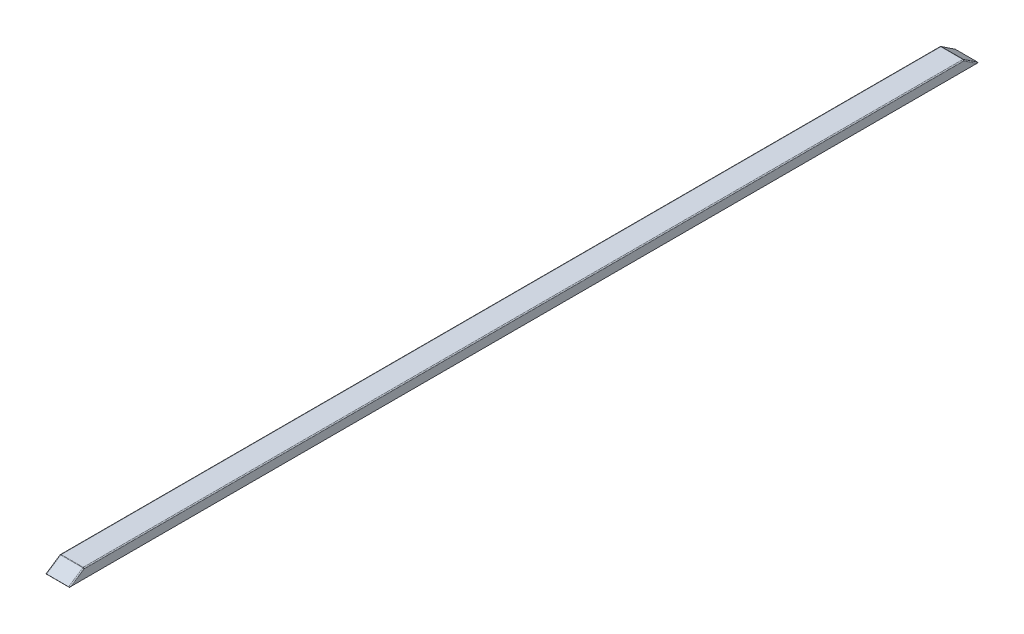
ISO-10303-21;
HEADER;
FILE_DESCRIPTION(('STEP AP214'),'2;1');
FILE_NAME('part.step','',(''),(''),'','','');
FILE_SCHEMA(('AUTOMOTIVE_DESIGN { 1 0 10303 214 1 1 1 1 }'));
ENDSEC;
DATA;
#1=APPLICATION_CONTEXT('core data for automotive mechanical design processes');
#2=APPLICATION_PROTOCOL_DEFINITION('international standard','automotive_design',2000,#1);
#3=PRODUCT_CONTEXT('',#1,'mechanical');
#4=PRODUCT('Part','Part','',(#3));
#5=PRODUCT_RELATED_PRODUCT_CATEGORY('part','',(#4));
#6=PRODUCT_DEFINITION_FORMATION('','',#4);
#7=PRODUCT_DEFINITION_CONTEXT('part definition',#1,'design');
#8=PRODUCT_DEFINITION('design','',#6,#7);
#9=PRODUCT_DEFINITION_SHAPE('','',#8);
#10=(LENGTH_UNIT() NAMED_UNIT(*) SI_UNIT(.MILLI.,.METRE.));
#11=(NAMED_UNIT(*) PLANE_ANGLE_UNIT() SI_UNIT($,.RADIAN.));
#12=(NAMED_UNIT(*) SI_UNIT($,.STERADIAN.) SOLID_ANGLE_UNIT());
#13=UNCERTAINTY_MEASURE_WITH_UNIT(LENGTH_MEASURE(1.E-05),#10,'distance_accuracy_value','');
#14=(GEOMETRIC_REPRESENTATION_CONTEXT(3) GLOBAL_UNCERTAINTY_ASSIGNED_CONTEXT((#13)) GLOBAL_UNIT_ASSIGNED_CONTEXT((#10,
#11,#12)) REPRESENTATION_CONTEXT('',''));
#15=CARTESIAN_POINT('',(0.,0.,0.));
#16=DIRECTION('',(0.,0.,1.));
#17=DIRECTION('',(1.,0.,0.));
#18=AXIS2_PLACEMENT_3D('',#15,#16,#17);
#19=CARTESIAN_POINT('',(0.,0.,1900.));
#20=DIRECTION('',(0.,1.,0.));
#21=DIRECTION('',(0.,0.,1.));
#22=AXIS2_PLACEMENT_3D('',#19,#20,#21);
#23=PLANE('',#22);
#24=DIRECTION('',(0.,0.,-1.));
#25=VECTOR('',#24,1.);
#26=CARTESIAN_POINT('',(0.,0.,1900.));
#27=LINE('',#26,#25);
#28=CARTESIAN_POINT('',(0.,0.,1896.39444872454));
#29=VERTEX_POINT('',#28);
#30=CARTESIAN_POINT('',(0.,0.,3.6055512754638));
#31=VERTEX_POINT('',#30);
#32=EDGE_CURVE('E320',#29,#31,#27,.T.);
#33=ORIENTED_EDGE('',*,*,#32,.T.);
#34=CARTESIAN_POINT('',(2.,-1.11022302462516E-13,3.60555127546358));
#35=DIRECTION('',(0.,1.,0.));
#36=DIRECTION('',(0.,0.,-1.));
#37=AXIS2_PLACEMENT_3D('',#34,#35,#36);
#38=ELLIPSE('',#37,3.60555127546399,2.);
#39=CARTESIAN_POINT('',(0.267949192431039,0.,1.8027756377319));
#40=VERTEX_POINT('',#39);
#41=EDGE_CURVE('E263',#31,#40,#38,.F.);
#42=ORIENTED_EDGE('',*,*,#41,.T.);
#43=DIRECTION('',(-1.,0.,0.));
#44=VECTOR('',#43,1.);
#45=CARTESIAN_POINT('',(0.,0.,1.8027756377319));
#46=LINE('',#45,#44);
#47=CARTESIAN_POINT('',(2.,-1.11022302462516E-13,1.80277563773146));
#48=VERTEX_POINT('',#47);
#49=EDGE_CURVE('E349',#48,#40,#46,.T.);
#50=ORIENTED_EDGE('',*,*,#49,.F.);
#51=DIRECTION('',(0.,0.,-1.));
#52=VECTOR('',#51,1.);
#53=CARTESIAN_POINT('',(2.,0.,1900.));
#54=LINE('',#53,#52);
#55=CARTESIAN_POINT('',(2.,0.,1898.19722436226));
#56=VERTEX_POINT('',#55);
#57=EDGE_CURVE('E332',#56,#48,#54,.T.);
#58=ORIENTED_EDGE('',*,*,#57,.F.);
#59=DIRECTION('',(1.,0.,0.));
#60=VECTOR('',#59,1.);
#61=CARTESIAN_POINT('',(0.,0.,1898.19722436226));
#62=LINE('',#61,#60);
#63=CARTESIAN_POINT('',(0.267949192428123,0.,1898.19722436226));
#64=VERTEX_POINT('',#63);
#65=EDGE_CURVE('E182',#64,#56,#62,.T.);
#66=ORIENTED_EDGE('',*,*,#65,.F.);
#67=CARTESIAN_POINT('',(2.,0.,1896.39444872454));
#68=DIRECTION('',(0.,1.,0.));
#69=DIRECTION('',(0.,0.,-1.));
#70=AXIS2_PLACEMENT_3D('',#67,#68,#69);
#71=ELLIPSE('',#70,3.60555127546401,2.);
#72=EDGE_CURVE('E235',#64,#29,#71,.F.);
#73=ORIENTED_EDGE('',*,*,#72,.T.);
#74=EDGE_LOOP('',(#33,#42,#50,#58,#66,#73));
#75=FACE_BOUND('',#74,.T.);
#76=ADVANCED_FACE('F35',(#75),#23,.F.);
#77=CARTESIAN_POINT('',(2.,0.,1900.));
#78=DIRECTION('',(-1.,0.,0.));
#79=DIRECTION('',(0.,0.,1.));
#80=AXIS2_PLACEMENT_3D('',#77,#78,#79);
#81=PLANE('',#80);
#82=DIRECTION('',(0.,0.554700196225229,-0.832050294337844));
#83=VECTOR('',#82,1.);
#84=CARTESIAN_POINT('',(2.,-0.832050294342159,1899.44529980377));
#85=LINE('',#84,#83);
#86=CARTESIAN_POINT('',(2.,16.,1874.19722436226));
#87=VERTEX_POINT('',#86);
#88=EDGE_CURVE('E175',#56,#87,#85,.T.);
#89=ORIENTED_EDGE('',*,*,#88,.F.);
#90=ORIENTED_EDGE('',*,*,#57,.T.);
#91=DIRECTION('',(0.,-0.554700196225229,-0.832050294337844));
#92=VECTOR('',#91,1.);
#93=CARTESIAN_POINT('',(2.,876.091026628739,1315.93931558084));
#94=LINE('',#93,#92);
#95=CARTESIAN_POINT('',(2.,16.,25.8027756377321));
#96=VERTEX_POINT('',#95);
#97=EDGE_CURVE('E200',#96,#48,#94,.T.);
#98=ORIENTED_EDGE('',*,*,#97,.F.);
#99=DIRECTION('',(0.,0.,-1.));
#100=VECTOR('',#99,1.);
#101=CARTESIAN_POINT('',(2.,16.,1900.));
#102=LINE('',#101,#100);
#103=EDGE_CURVE('E193',#96,#87,#102,.F.);
#104=ORIENTED_EDGE('',*,*,#103,.T.);
#105=EDGE_LOOP('',(#89,#90,#98,#104));
#106=FACE_BOUND('',#105,.T.);
#107=ADVANCED_FACE('F198',(#106),#81,.F.);
#108=CARTESIAN_POINT('',(2.,18.,1900.));
#109=DIRECTION('',(0.,1.,0.));
#110=DIRECTION('',(0.,0.,1.));
#111=AXIS2_PLACEMENT_3D('',#108,#109,#110);
#112=PLANE('',#111);
#113=DIRECTION('',(1.,0.,0.));
#114=VECTOR('',#113,1.);
#115=CARTESIAN_POINT('',(2.,18.,1871.19722436226));
#116=LINE('',#115,#114);
#117=CARTESIAN_POINT('',(4.,18.,1871.19722436226));
#118=VERTEX_POINT('',#117);
#119=CARTESIAN_POINT('',(46.,18.,1871.19722436226));
#120=VERTEX_POINT('',#119);
#121=EDGE_CURVE('E186',#118,#120,#116,.T.);
#122=ORIENTED_EDGE('',*,*,#121,.F.);
#123=DIRECTION('',(0.,0.,-1.));
#124=VECTOR('',#123,1.);
#125=CARTESIAN_POINT('',(4.,18.,0.));
#126=LINE('',#125,#124);
#127=CARTESIAN_POINT('',(4.,18.,28.8027756377321));
#128=VERTEX_POINT('',#127);
#129=EDGE_CURVE('E195',#118,#128,#126,.T.);
#130=ORIENTED_EDGE('',*,*,#129,.T.);
#131=DIRECTION('',(-1.,0.,0.));
#132=VECTOR('',#131,1.);
#133=CARTESIAN_POINT('',(2.,18.,28.802775637732));
#134=LINE('',#133,#132);
#135=CARTESIAN_POINT('',(46.,18.,28.802775637732));
#136=VERTEX_POINT('',#135);
#137=EDGE_CURVE('E338',#136,#128,#134,.T.);
#138=ORIENTED_EDGE('',*,*,#137,.F.);
#139=DIRECTION('',(0.,0.,-1.));
#140=VECTOR('',#139,1.);
#141=CARTESIAN_POINT('',(46.,18.,1900.));
#142=LINE('',#141,#140);
#143=EDGE_CURVE('E202',#136,#120,#142,.F.);
#144=ORIENTED_EDGE('',*,*,#143,.T.);
#145=EDGE_LOOP('',(#122,#130,#138,#144));
#146=FACE_BOUND('',#145,.T.);
#147=ADVANCED_FACE('F336',(#146),#112,.F.);
#148=CARTESIAN_POINT('',(48.,18.,1900.));
#149=DIRECTION('',(1.,0.,0.));
#150=DIRECTION('',(0.,0.,-1.));
#151=AXIS2_PLACEMENT_3D('',#148,#149,#150);
#152=PLANE('',#151);
#153=DIRECTION('',(0.,-0.554700196225229,0.832050294337844));
#154=VECTOR('',#153,1.);
#155=CARTESIAN_POINT('',(48.,4.70641124411937,1891.13760749608));
#156=LINE('',#155,#154);
#157=CARTESIAN_POINT('',(48.,16.,1874.19722436226));
#158=VERTEX_POINT('',#157);
#159=CARTESIAN_POINT('',(48.,0.,1898.19722436226));
#160=VERTEX_POINT('',#159);
#161=EDGE_CURVE('E363',#158,#160,#156,.T.);
#162=ORIENTED_EDGE('',*,*,#161,.F.);
#163=DIRECTION('',(0.,0.,-1.));
#164=VECTOR('',#163,1.);
#165=CARTESIAN_POINT('',(48.,16.,0.));
#166=LINE('',#165,#164);
#167=CARTESIAN_POINT('',(48.,16.,25.8027756377321));
#168=VERTEX_POINT('',#167);
#169=EDGE_CURVE('E334',#158,#168,#166,.T.);
#170=ORIENTED_EDGE('',*,*,#169,.T.);
#171=DIRECTION('',(0.,0.554700196225229,0.832050294337844));
#172=VECTOR('',#171,1.);
#173=CARTESIAN_POINT('',(48.,881.629488167201,1324.24700788853));
#174=LINE('',#173,#172);
#175=CARTESIAN_POINT('',(48.,0.,1.80277563773235));
#176=VERTEX_POINT('',#175);
#177=EDGE_CURVE('E322',#176,#168,#174,.T.);
#178=ORIENTED_EDGE('',*,*,#177,.F.);
#179=DIRECTION('',(0.,0.,-1.));
#180=VECTOR('',#179,1.);
#181=CARTESIAN_POINT('',(48.,0.,1900.));
#182=LINE('',#181,#180);
#183=EDGE_CURVE('E329',#160,#176,#182,.T.);
#184=ORIENTED_EDGE('',*,*,#183,.F.);
#185=EDGE_LOOP('',(#162,#170,#178,#184));
#186=FACE_BOUND('',#185,.T.);
#187=ADVANCED_FACE('F361',(#186),#152,.F.);
#188=CARTESIAN_POINT('',(48.,0.,1900.));
#189=DIRECTION('',(0.,1.,0.));
#190=DIRECTION('',(0.,0.,1.));
#191=AXIS2_PLACEMENT_3D('',#188,#189,#190);
#192=PLANE('',#191);
#193=DIRECTION('',(-1.,0.,0.));
#194=VECTOR('',#193,1.);
#195=CARTESIAN_POINT('',(48.,0.,1.8027756377319));
#196=LINE('',#195,#194);
#197=CARTESIAN_POINT('',(49.7320508075689,0.,1.8027756377319));
#198=VERTEX_POINT('',#197);
#199=EDGE_CURVE('E317',#198,#176,#196,.T.);
#200=ORIENTED_EDGE('',*,*,#199,.F.);
#201=CARTESIAN_POINT('',(48.,-1.11022302462516E-13,3.6055512754638));
#202=DIRECTION('',(0.,1.,0.));
#203=DIRECTION('',(0.,0.,1.));
#204=AXIS2_PLACEMENT_3D('',#201,#202,#203);
#205=ELLIPSE('',#204,3.60555127546399,2.);
#206=CARTESIAN_POINT('',(50.,0.,3.60555127546403));
#207=VERTEX_POINT('',#206);
#208=EDGE_CURVE('E59',#198,#207,#205,.F.);
#209=ORIENTED_EDGE('',*,*,#208,.T.);
#210=DIRECTION('',(0.,0.,-1.));
#211=VECTOR('',#210,1.);
#212=CARTESIAN_POINT('',(50.,0.,1900.));
#213=LINE('',#212,#211);
#214=CARTESIAN_POINT('',(50.,0.,1896.39444872454));
#215=VERTEX_POINT('',#214);
#216=EDGE_CURVE('E327',#215,#207,#213,.T.);
#217=ORIENTED_EDGE('',*,*,#216,.F.);
#218=CARTESIAN_POINT('',(48.,0.,1896.39444872454));
#219=DIRECTION('',(0.,1.,0.));
#220=DIRECTION('',(0.,0.,1.));
#221=AXIS2_PLACEMENT_3D('',#218,#219,#220);
#222=ELLIPSE('',#221,3.60555127546401,2.);
#223=CARTESIAN_POINT('',(49.7320508075719,0.,1898.19722436226));
#224=VERTEX_POINT('',#223);
#225=EDGE_CURVE('E242',#215,#224,#222,.F.);
#226=ORIENTED_EDGE('',*,*,#225,.T.);
#227=DIRECTION('',(1.,0.,0.));
#228=VECTOR('',#227,1.);
#229=CARTESIAN_POINT('',(48.,0.,1898.19722436226));
#230=LINE('',#229,#228);
#231=EDGE_CURVE('E351',#160,#224,#230,.T.);
#232=ORIENTED_EDGE('',*,*,#231,.F.);
#233=ORIENTED_EDGE('',*,*,#183,.T.);
#234=EDGE_LOOP('',(#200,#209,#217,#226,#232,#233));
#235=FACE_BOUND('',#234,.T.);
#236=ADVANCED_FACE('F449',(#235),#192,.F.);
#237=CARTESIAN_POINT('',(46.,16.,1900.));
#238=DIRECTION('',(0.,0.,1.));
#239=DIRECTION('',(1.,0.,0.));
#240=AXIS2_PLACEMENT_3D('',#237,#238,#239);
#241=CYLINDRICAL_SURFACE('',#240,2.);
#242=CARTESIAN_POINT('',(46.,16.,1874.19722436226));
#243=DIRECTION('',(0.,0.832050294337844,0.554700196225229));
#244=DIRECTION('',(0.,-0.554700196225229,0.832050294337844));
#245=AXIS2_PLACEMENT_3D('',#242,#243,#244);
#246=ELLIPSE('',#245,3.60555127546399,2.);
#247=EDGE_CURVE('E367',#120,#158,#246,.F.);
#248=ORIENTED_EDGE('',*,*,#247,.F.);
#249=ORIENTED_EDGE('',*,*,#143,.F.);
#250=CARTESIAN_POINT('',(46.,16.,25.8027756377321));
#251=DIRECTION('',(0.,0.832050294337843,-0.554700196225229));
#252=DIRECTION('',(0.,0.554700196225229,0.832050294337844));
#253=AXIS2_PLACEMENT_3D('',#250,#251,#252);
#254=ELLIPSE('',#253,3.60555127546399,2.);
#255=EDGE_CURVE('E346',#168,#136,#254,.F.);
#256=ORIENTED_EDGE('',*,*,#255,.F.);
#257=ORIENTED_EDGE('',*,*,#169,.F.);
#258=EDGE_LOOP('',(#248,#249,#256,#257));
#259=FACE_BOUND('',#258,.T.);
#260=ADVANCED_FACE('F366',(#259),#241,.F.);
#261=CARTESIAN_POINT('',(4.,16.,1900.));
#262=DIRECTION('',(0.,0.,1.));
#263=DIRECTION('',(1.,0.,0.));
#264=AXIS2_PLACEMENT_3D('',#261,#262,#263);
#265=CYLINDRICAL_SURFACE('',#264,2.);
#266=CARTESIAN_POINT('',(4.,16.,1874.19722436226));
#267=DIRECTION('',(0.,0.832050294337844,0.554700196225229));
#268=DIRECTION('',(0.,-0.554700196225229,0.832050294337844));
#269=AXIS2_PLACEMENT_3D('',#266,#267,#268);
#270=ELLIPSE('',#269,3.60555127546399,2.);
#271=EDGE_CURVE('E179',#87,#118,#270,.F.);
#272=ORIENTED_EDGE('',*,*,#271,.F.);
#273=ORIENTED_EDGE('',*,*,#103,.F.);
#274=CARTESIAN_POINT('',(4.,16.,25.8027756377321));
#275=DIRECTION('',(0.,0.832050294337843,-0.554700196225229));
#276=DIRECTION('',(0.,0.554700196225229,0.832050294337844));
#277=AXIS2_PLACEMENT_3D('',#274,#275,#276);
#278=ELLIPSE('',#277,3.60555127546399,2.);
#279=EDGE_CURVE('E216',#128,#96,#278,.F.);
#280=ORIENTED_EDGE('',*,*,#279,.F.);
#281=ORIENTED_EDGE('',*,*,#129,.F.);
#282=EDGE_LOOP('',(#272,#273,#280,#281));
#283=FACE_BOUND('',#282,.T.);
#284=ADVANCED_FACE('F191',(#283),#265,.F.);
#285=CARTESIAN_POINT('',(50.,20.,1900.));
#286=DIRECTION('',(-1.,0.,0.));
#287=DIRECTION('',(0.,0.,1.));
#288=AXIS2_PLACEMENT_3D('',#285,#286,#287);
#289=PLANE('',#288);
#290=ORIENTED_EDGE('',*,*,#216,.T.);
#291=DIRECTION('',(0.,0.554700196225229,0.832050294337844));
#292=VECTOR('',#291,1.);
#293=CARTESIAN_POINT('',(50.,881.412822488247,1325.72478500783));
#294=LINE('',#293,#292);
#295=CARTESIAN_POINT('',(50.,18.,30.6055512754639));
#296=VERTEX_POINT('',#295);
#297=EDGE_CURVE('E281',#207,#296,#294,.T.);
#298=ORIENTED_EDGE('',*,*,#297,.T.);
#299=DIRECTION('',(0.,0.,-1.));
#300=VECTOR('',#299,1.);
#301=CARTESIAN_POINT('',(50.,18.,1900.));
#302=LINE('',#301,#300);
#303=CARTESIAN_POINT('',(50.,18.,1869.39444872454));
#304=VERTEX_POINT('',#303);
#305=EDGE_CURVE('E214',#296,#304,#302,.F.);
#306=ORIENTED_EDGE('',*,*,#305,.T.);
#307=DIRECTION('',(0.,-0.554700196225226,0.832050294337846));
#308=VECTOR('',#307,1.);
#309=CARTESIAN_POINT('',(50.,4.48974556517031,1889.65983037678));
#310=LINE('',#309,#308);
#311=EDGE_CURVE('E240',#304,#215,#310,.T.);
#312=ORIENTED_EDGE('',*,*,#311,.T.);
#313=EDGE_LOOP('',(#290,#298,#306,#312));
#314=FACE_BOUND('',#313,.T.);
#315=ADVANCED_FACE('F452',(#314),#289,.F.);
#316=CARTESIAN_POINT('',(0.,20.,1900.));
#317=DIRECTION('',(0.,-1.,0.));
#318=DIRECTION('',(0.,0.,-1.));
#319=AXIS2_PLACEMENT_3D('',#316,#317,#318);
#320=PLANE('',#319);
#321=DIRECTION('',(0.,0.,-1.));
#322=VECTOR('',#321,1.);
#323=CARTESIAN_POINT('',(48.,20.,1900.));
#324=LINE('',#323,#322);
#325=CARTESIAN_POINT('',(48.,20.,1869.39444872454));
#326=VERTEX_POINT('',#325);
#327=CARTESIAN_POINT('',(48.,20.,30.6055512754639));
#328=VERTEX_POINT('',#327);
#329=EDGE_CURVE('E205',#326,#328,#324,.T.);
#330=ORIENTED_EDGE('',*,*,#329,.T.);
#331=DIRECTION('',(1.,0.,0.));
#332=VECTOR('',#331,1.);
#333=CARTESIAN_POINT('',(0.,20.,30.6055512754639));
#334=LINE('',#333,#332);
#335=CARTESIAN_POINT('',(2.,20.,30.6055512754639));
#336=VERTEX_POINT('',#335);
#337=EDGE_CURVE('E11',#328,#336,#334,.F.);
#338=ORIENTED_EDGE('',*,*,#337,.T.);
#339=DIRECTION('',(0.,0.,-1.));
#340=VECTOR('',#339,1.);
#341=CARTESIAN_POINT('',(2.,20.,1900.));
#342=LINE('',#341,#340);
#343=CARTESIAN_POINT('',(2.,20.,1869.39444872454));
#344=VERTEX_POINT('',#343);
#345=EDGE_CURVE('E212',#336,#344,#342,.F.);
#346=ORIENTED_EDGE('',*,*,#345,.T.);
#347=DIRECTION('',(1.,0.,0.));
#348=VECTOR('',#347,1.);
#349=CARTESIAN_POINT('',(0.,20.,1869.39444872454));
#350=LINE('',#349,#348);
#351=EDGE_CURVE('E247',#344,#326,#350,.T.);
#352=ORIENTED_EDGE('',*,*,#351,.T.);
#353=EDGE_LOOP('',(#330,#338,#346,#352));
#354=FACE_BOUND('',#353,.T.);
#355=ADVANCED_FACE('F423',(#354),#320,.F.);
#356=CARTESIAN_POINT('',(0.,0.,1900.));
#357=DIRECTION('',(1.,0.,0.));
#358=DIRECTION('',(0.,0.,-1.));
#359=AXIS2_PLACEMENT_3D('',#356,#357,#358);
#360=PLANE('',#359);
#361=DIRECTION('',(0.,0.,-1.));
#362=VECTOR('',#361,1.);
#363=CARTESIAN_POINT('',(0.,18.,1900.));
#364=LINE('',#363,#362);
#365=CARTESIAN_POINT('',(0.,18.,1869.39444872454));
#366=VERTEX_POINT('',#365);
#367=CARTESIAN_POINT('',(0.,18.,30.6055512754639));
#368=VERTEX_POINT('',#367);
#369=EDGE_CURVE('E201',#366,#368,#364,.T.);
#370=ORIENTED_EDGE('',*,*,#369,.T.);
#371=DIRECTION('',(0.,-0.554700196225229,-0.832050294337844));
#372=VECTOR('',#371,1.);
#373=CARTESIAN_POINT('',(0.,875.258976334402,1316.49401577707));
#374=LINE('',#373,#372);
#375=EDGE_CURVE('E249',#368,#31,#374,.T.);
#376=ORIENTED_EDGE('',*,*,#375,.T.);
#377=ORIENTED_EDGE('',*,*,#32,.F.);
#378=DIRECTION('',(0.,0.554700196225226,-0.832050294337846));
#379=VECTOR('',#378,1.);
#380=CARTESIAN_POINT('',(0.,-1.66410058867578,1898.89059960755));
#381=LINE('',#380,#379);
#382=EDGE_CURVE('E218',#29,#366,#381,.T.);
#383=ORIENTED_EDGE('',*,*,#382,.T.);
#384=EDGE_LOOP('',(#370,#376,#377,#383));
#385=FACE_BOUND('',#384,.T.);
#386=ADVANCED_FACE('F405',(#385),#360,.F.);
#387=CARTESIAN_POINT('',(2.,18.,1900.));
#388=DIRECTION('',(0.,0.,-1.));
#389=DIRECTION('',(-1.,0.,0.));
#390=AXIS2_PLACEMENT_3D('',#387,#388,#389);
#391=CYLINDRICAL_SURFACE('',#390,2.);
#392=ORIENTED_EDGE('',*,*,#345,.F.);
#393=CARTESIAN_POINT('',(2.,18.,30.6055512754639));
#394=DIRECTION('',(0.,0.,-1.));
#395=DIRECTION('',(-1.,0.,0.));
#396=AXIS2_PLACEMENT_3D('',#393,#394,#395);
#397=CIRCLE('',#396,2.);
#398=EDGE_CURVE('E279',#336,#368,#397,.F.);
#399=ORIENTED_EDGE('',*,*,#398,.T.);
#400=ORIENTED_EDGE('',*,*,#369,.F.);
#401=CARTESIAN_POINT('',(2.,18.,1869.39444872454));
#402=DIRECTION('',(0.,0.,-1.));
#403=DIRECTION('',(-1.,0.,0.));
#404=AXIS2_PLACEMENT_3D('',#401,#402,#403);
#405=CIRCLE('',#404,2.);
#406=EDGE_CURVE('E237',#366,#344,#405,.T.);
#407=ORIENTED_EDGE('',*,*,#406,.T.);
#408=EDGE_LOOP('',(#392,#399,#400,#407));
#409=FACE_BOUND('',#408,.T.);
#410=ADVANCED_FACE('F408',(#409),#391,.T.);
#411=CARTESIAN_POINT('',(48.,18.,1900.));
#412=DIRECTION('',(0.,0.,-1.));
#413=DIRECTION('',(-1.,0.,0.));
#414=AXIS2_PLACEMENT_3D('',#411,#412,#413);
#415=CYLINDRICAL_SURFACE('',#414,2.);
#416=ORIENTED_EDGE('',*,*,#305,.F.);
#417=CARTESIAN_POINT('',(48.,18.,30.6055512754639));
#418=DIRECTION('',(0.,0.,-1.));
#419=DIRECTION('',(-1.,0.,0.));
#420=AXIS2_PLACEMENT_3D('',#417,#418,#419);
#421=CIRCLE('',#420,2.);
#422=EDGE_CURVE('E44',#296,#328,#421,.F.);
#423=ORIENTED_EDGE('',*,*,#422,.T.);
#424=ORIENTED_EDGE('',*,*,#329,.F.);
#425=CARTESIAN_POINT('',(48.,18.,1869.39444872454));
#426=DIRECTION('',(0.,0.,-1.));
#427=DIRECTION('',(-1.,0.,0.));
#428=AXIS2_PLACEMENT_3D('',#425,#426,#427);
#429=CIRCLE('',#428,2.);
#430=EDGE_CURVE('E244',#326,#304,#429,.T.);
#431=ORIENTED_EDGE('',*,*,#430,.T.);
#432=EDGE_LOOP('',(#416,#423,#424,#431));
#433=FACE_BOUND('',#432,.T.);
#434=ADVANCED_FACE('F425',(#433),#415,.T.);
#435=CARTESIAN_POINT('',(0.,0.,1900.));
#436=DIRECTION('',(0.,-0.832050294337846,-0.554700196225226));
#437=DIRECTION('',(0.,0.554700196225226,-0.832050294337846));
#438=AXIS2_PLACEMENT_3D('',#435,#436,#437);
#439=PLANE('',#438);
#440=DIRECTION('',(1.,0.,0.));
#441=VECTOR('',#440,1.);
#442=CARTESIAN_POINT('',(0.,19.6641005886757,1870.50384911699));
#443=LINE('',#442,#441);
#444=CARTESIAN_POINT('',(48.,19.6641005886757,1870.50384911699));
#445=VERTEX_POINT('',#444);
#446=CARTESIAN_POINT('',(2.,19.6641005886757,1870.50384911699));
#447=VERTEX_POINT('',#446);
#448=EDGE_CURVE('E221',#445,#447,#443,.F.);
#449=ORIENTED_EDGE('',*,*,#448,.T.);
#450=DIRECTION('',(0.,0.554700196225226,-0.832050294337846));
#451=VECTOR('',#450,1.);
#452=CARTESIAN_POINT('',(2.,0.,1900.));
#453=LINE('',#452,#451);
#454=CARTESIAN_POINT('',(2.,0.,1900.));
#455=VERTEX_POINT('',#454);
#456=EDGE_CURVE('E225',#447,#455,#453,.F.);
#457=ORIENTED_EDGE('',*,*,#456,.T.);
#458=DIRECTION('',(1.,0.,0.));
#459=VECTOR('',#458,1.);
#460=CARTESIAN_POINT('',(0.,0.,1900.));
#461=LINE('',#460,#459);
#462=CARTESIAN_POINT('',(48.,0.,1900.));
#463=VERTEX_POINT('',#462);
#464=EDGE_CURVE('E316',#455,#463,#461,.T.);
#465=ORIENTED_EDGE('',*,*,#464,.T.);
#466=DIRECTION('',(0.,-0.554700196225226,0.832050294337846));
#467=VECTOR('',#466,1.);
#468=CARTESIAN_POINT('',(48.,0.,1900.));
#469=LINE('',#468,#467);
#470=EDGE_CURVE('E223',#463,#445,#469,.F.);
#471=ORIENTED_EDGE('',*,*,#470,.T.);
#472=EDGE_LOOP('',(#449,#457,#465,#471));
#473=FACE_BOUND('',#472,.T.);
#474=ADVANCED_FACE('F387',(#473),#439,.F.);
#475=CARTESIAN_POINT('',(0.,0.,0.));
#476=DIRECTION('',(0.,-0.832050294337843,0.554700196225229));
#477=DIRECTION('',(0.,-0.554700196225229,-0.832050294337844));
#478=AXIS2_PLACEMENT_3D('',#475,#476,#477);
#479=PLANE('',#478);
#480=DIRECTION('',(1.,0.,0.));
#481=VECTOR('',#480,1.);
#482=CARTESIAN_POINT('',(48.,0.,0.));
#483=LINE('',#482,#481);
#484=CARTESIAN_POINT('',(2.,0.,0.));
#485=VERTEX_POINT('',#484);
#486=CARTESIAN_POINT('',(48.,0.,0.));
#487=VERTEX_POINT('',#486);
#488=EDGE_CURVE('E309',#485,#487,#483,.T.);
#489=ORIENTED_EDGE('',*,*,#488,.F.);
#490=DIRECTION('',(0.,-0.554700196225229,-0.832050294337844));
#491=VECTOR('',#490,1.);
#492=CARTESIAN_POINT('',(2.,0.,0.));
#493=LINE('',#492,#491);
#494=CARTESIAN_POINT('',(2.,19.6641005886757,29.4961508830135));
#495=VERTEX_POINT('',#494);
#496=EDGE_CURVE('E277',#485,#495,#493,.F.);
#497=ORIENTED_EDGE('',*,*,#496,.T.);
#498=DIRECTION('',(1.,0.,0.));
#499=VECTOR('',#498,1.);
#500=CARTESIAN_POINT('',(0.,19.6641005886757,29.4961508830135));
#501=LINE('',#500,#499);
#502=CARTESIAN_POINT('',(48.,19.6641005886757,29.4961508830135));
#503=VERTEX_POINT('',#502);
#504=EDGE_CURVE('E273',#495,#503,#501,.T.);
#505=ORIENTED_EDGE('',*,*,#504,.T.);
#506=DIRECTION('',(0.,0.554700196225229,0.832050294337844));
#507=VECTOR('',#506,1.);
#508=CARTESIAN_POINT('',(48.,0.,0.));
#509=LINE('',#508,#507);
#510=EDGE_CURVE('E275',#503,#487,#509,.F.);
#511=ORIENTED_EDGE('',*,*,#510,.T.);
#512=EDGE_LOOP('',(#489,#497,#505,#511));
#513=FACE_BOUND('',#512,.T.);
#514=ADVANCED_FACE('F308',(#513),#479,.F.);
#515=CARTESIAN_POINT('',(2.,17.1679497056623,27.5547001962255));
#516=DIRECTION('',(0.,0.832050294337843,-0.554700196225229));
#517=DIRECTION('',(0.,0.554700196225229,0.832050294337844));
#518=AXIS2_PLACEMENT_3D('',#515,#516,#517);
#519=PLANE('',#518);
#520=ORIENTED_EDGE('',*,*,#49,.T.);
#521=DIRECTION('',(0.,-0.554700196225229,-0.832050294337844));
#522=VECTOR('',#521,1.);
#523=CARTESIAN_POINT('',(0.267949192431039,0.,1.8027756377319));
#524=LINE('',#523,#522);
#525=CARTESIAN_POINT('',(0.267949192431027,-0.832050294338015,0.554700196224973));
#526=VERTEX_POINT('',#525);
#527=EDGE_CURVE('E267',#40,#526,#524,.T.);
#528=ORIENTED_EDGE('',*,*,#527,.T.);
#529=DIRECTION('',(-1.,0.,0.));
#530=VECTOR('',#529,1.);
#531=CARTESIAN_POINT('',(0.,-0.832050294337844,0.554700196225229));
#532=LINE('',#531,#530);
#533=CARTESIAN_POINT('',(49.7320508075689,-0.832050294337844,0.554700196225229));
#534=VERTEX_POINT('',#533);
#535=EDGE_CURVE('E347',#534,#526,#532,.T.);
#536=ORIENTED_EDGE('',*,*,#535,.F.);
#537=DIRECTION('',(0.,0.554700196225229,0.832050294337844));
#538=VECTOR('',#537,1.);
#539=CARTESIAN_POINT('',(49.7320508075689,-0.832050294337844,0.554700196225229));
#540=LINE('',#539,#538);
#541=EDGE_CURVE('E265',#534,#198,#540,.T.);
#542=ORIENTED_EDGE('',*,*,#541,.T.);
#543=ORIENTED_EDGE('',*,*,#199,.T.);
#544=ORIENTED_EDGE('',*,*,#177,.T.);
#545=ORIENTED_EDGE('',*,*,#255,.T.);
#546=ORIENTED_EDGE('',*,*,#137,.T.);
#547=ORIENTED_EDGE('',*,*,#279,.T.);
#548=ORIENTED_EDGE('',*,*,#97,.T.);
#549=EDGE_LOOP('',(#520,#528,#536,#542,#543,#544,#545,#546,#547,#548));
#550=FACE_BOUND('',#549,.T.);
#551=ADVANCED_FACE('F343',(#550),#519,.F.);
#552=CARTESIAN_POINT('',(0.,-0.832050294337844,0.554700196225229));
#553=DIRECTION('',(0.,-0.554700196225229,-0.832050294337844));
#554=DIRECTION('',(0.,0.832050294337844,-0.554700196225229));
#555=AXIS2_PLACEMENT_3D('',#552,#553,#554);
#556=PLANE('',#555);
#557=ORIENTED_EDGE('',*,*,#535,.T.);
#558=CARTESIAN_POINT('',(2.,-1.66410058867572,1.10940039245011));
#559=DIRECTION('',(0.,-0.554700196225229,-0.832050294337844));
#560=DIRECTION('',(0.,0.832050294337844,-0.554700196225229));
#561=AXIS2_PLACEMENT_3D('',#558,#559,#560);
#562=CIRCLE('',#561,2.);
#563=EDGE_CURVE('E271',#526,#485,#562,.T.);
#564=ORIENTED_EDGE('',*,*,#563,.T.);
#565=ORIENTED_EDGE('',*,*,#488,.T.);
#566=CARTESIAN_POINT('',(48.,-1.66410058867583,1.10940039245011));
#567=DIRECTION('',(0.,-0.554700196225229,-0.832050294337844));
#568=DIRECTION('',(0.,0.832050294337844,-0.554700196225229));
#569=AXIS2_PLACEMENT_3D('',#566,#567,#568);
#570=CIRCLE('',#569,2.);
#571=EDGE_CURVE('E269',#487,#534,#570,.T.);
#572=ORIENTED_EDGE('',*,*,#571,.T.);
#573=EDGE_LOOP('',(#557,#564,#565,#572));
#574=FACE_BOUND('',#573,.T.);
#575=ADVANCED_FACE('F313',(#574),#556,.T.);
#576=CARTESIAN_POINT('',(48.,17.1679497056577,1872.44529980377));
#577=DIRECTION('',(0.,0.832050294337844,0.554700196225229));
#578=DIRECTION('',(0.,-0.554700196225229,0.832050294337844));
#579=AXIS2_PLACEMENT_3D('',#576,#577,#578);
#580=PLANE('',#579);
#581=DIRECTION('',(1.,0.,0.));
#582=VECTOR('',#581,1.);
#583=CARTESIAN_POINT('',(0.,-0.832050294342285,1899.44529980377));
#584=LINE('',#583,#582);
#585=CARTESIAN_POINT('',(0.267949192428179,-0.832050294342285,1899.44529980377));
#586=VERTEX_POINT('',#585);
#587=CARTESIAN_POINT('',(49.7320508075718,-0.832050294342246,1899.44529980377));
#588=VERTEX_POINT('',#587);
#589=EDGE_CURVE('E196',#586,#588,#584,.T.);
#590=ORIENTED_EDGE('',*,*,#589,.F.);
#591=DIRECTION('',(0.,0.554700196225226,-0.832050294337846));
#592=VECTOR('',#591,1.);
#593=CARTESIAN_POINT('',(0.267949192428234,-0.832050294342285,1899.44529980377));
#594=LINE('',#593,#592);
#595=EDGE_CURVE('E233',#586,#64,#594,.T.);
#596=ORIENTED_EDGE('',*,*,#595,.T.);
#597=ORIENTED_EDGE('',*,*,#65,.T.);
#598=ORIENTED_EDGE('',*,*,#88,.T.);
#599=ORIENTED_EDGE('',*,*,#271,.T.);
#600=ORIENTED_EDGE('',*,*,#121,.T.);
#601=ORIENTED_EDGE('',*,*,#247,.T.);
#602=ORIENTED_EDGE('',*,*,#161,.T.);
#603=ORIENTED_EDGE('',*,*,#231,.T.);
#604=DIRECTION('',(0.,-0.554700196225226,0.832050294337846));
#605=VECTOR('',#604,1.);
#606=CARTESIAN_POINT('',(49.7320508075719,0.,1898.19722436226));
#607=LINE('',#606,#605);
#608=EDGE_CURVE('E231',#224,#588,#607,.T.);
#609=ORIENTED_EDGE('',*,*,#608,.T.);
#610=EDGE_LOOP('',(#590,#596,#597,#598,#599,#600,#601,#602,#603,#609));
#611=FACE_BOUND('',#610,.T.);
#612=ADVANCED_FACE('F178',(#611),#580,.F.);
#613=CARTESIAN_POINT('',(0.,-0.832050294342285,1899.44529980377));
#614=DIRECTION('',(0.,-0.554700196225229,0.832050294337844));
#615=DIRECTION('',(0.,-0.832050294337844,-0.554700196225229));
#616=AXIS2_PLACEMENT_3D('',#613,#614,#615);
#617=PLANE('',#616);
#618=ORIENTED_EDGE('',*,*,#464,.F.);
#619=CARTESIAN_POINT('',(2.,-1.66410058867593,1898.89059960755));
#620=DIRECTION('',(0.,-0.554700196225229,0.832050294337844));
#621=DIRECTION('',(0.,-0.832050294337844,-0.554700196225229));
#622=AXIS2_PLACEMENT_3D('',#619,#620,#621);
#623=CIRCLE('',#622,2.);
#624=EDGE_CURVE('E229',#455,#586,#623,.T.);
#625=ORIENTED_EDGE('',*,*,#624,.T.);
#626=ORIENTED_EDGE('',*,*,#589,.T.);
#627=CARTESIAN_POINT('',(48.,-1.66410058867591,1898.89059960755));
#628=DIRECTION('',(0.,-0.554700196225229,0.832050294337844));
#629=DIRECTION('',(0.,-0.832050294337844,-0.554700196225229));
#630=AXIS2_PLACEMENT_3D('',#627,#628,#629);
#631=CIRCLE('',#630,2.);
#632=EDGE_CURVE('E227',#588,#463,#631,.T.);
#633=ORIENTED_EDGE('',*,*,#632,.T.);
#634=EDGE_LOOP('',(#618,#625,#626,#633));
#635=FACE_BOUND('',#634,.T.);
#636=ADVANCED_FACE('F384',(#635),#617,.T.);
#637=CARTESIAN_POINT('',(48.,4.48974556517034,1889.65983037678));
#638=DIRECTION('',(0.,-0.554700196225226,0.832050294337846));
#639=DIRECTION('',(0.,-0.832050294337846,-0.554700196225226));
#640=AXIS2_PLACEMENT_3D('',#637,#638,#639);
#641=CYLINDRICAL_SURFACE('',#640,2.);
#642=ORIENTED_EDGE('',*,*,#225,.F.);
#643=ORIENTED_EDGE('',*,*,#311,.F.);
#644=CARTESIAN_POINT('',(48.,17.9999999999999,1869.39444872454));
#645=DIRECTION('',(0.,0.554700196225261,-0.832050294337822));
#646=DIRECTION('',(0.,0.832050294337822,0.554700196225261));
#647=AXIS2_PLACEMENT_3D('',#644,#645,#646);
#648=CIRCLE('',#647,2.);
#649=EDGE_CURVE('E258',#445,#304,#648,.T.);
#650=ORIENTED_EDGE('',*,*,#649,.F.);
#651=ORIENTED_EDGE('',*,*,#470,.F.);
#652=ORIENTED_EDGE('',*,*,#632,.F.);
#653=ORIENTED_EDGE('',*,*,#608,.F.);
#654=EDGE_LOOP('',(#642,#643,#650,#651,#652,#653));
#655=FACE_BOUND('',#654,.T.);
#656=ADVANCED_FACE('F378',(#655),#641,.T.);
#657=CARTESIAN_POINT('',(48.,18.,1869.39444872454));
#658=DIRECTION('',(0.,-0.832050294337846,-0.554700196225226));
#659=DIRECTION('',(0.,0.554700196225226,-0.832050294337846));
#660=AXIS2_PLACEMENT_3D('',#657,#658,#659);
#661=SPHERICAL_SURFACE('',#660,2.);
#662=ORIENTED_EDGE('',*,*,#649,.T.);
#663=ORIENTED_EDGE('',*,*,#430,.F.);
#664=CARTESIAN_POINT('',(48.,18.0000000000001,1869.39444872454));
#665=DIRECTION('',(-1.,0.,0.));
#666=DIRECTION('',(0.,0.,1.));
#667=AXIS2_PLACEMENT_3D('',#664,#665,#666);
#668=CIRCLE('',#667,2.);
#669=EDGE_CURVE('E255',#445,#326,#668,.T.);
#670=ORIENTED_EDGE('',*,*,#669,.F.);
#671=EDGE_LOOP('',(#662,#663,#670));
#672=FACE_BOUND('',#671,.T.);
#673=ADVANCED_FACE('F428',(#672),#661,.T.);
#674=CARTESIAN_POINT('',(0.,18.,1869.39444872454));
#675=DIRECTION('',(1.,0.,0.));
#676=DIRECTION('',(0.,0.,-1.));
#677=AXIS2_PLACEMENT_3D('',#674,#675,#676);
#678=CYLINDRICAL_SURFACE('',#677,2.);
#679=ORIENTED_EDGE('',*,*,#669,.T.);
#680=ORIENTED_EDGE('',*,*,#351,.F.);
#681=CARTESIAN_POINT('',(2.,18.,1869.39444872454));
#682=DIRECTION('',(-1.,0.,0.));
#683=DIRECTION('',(0.,0.,1.));
#684=AXIS2_PLACEMENT_3D('',#681,#682,#683);
#685=CIRCLE('',#684,2.);
#686=EDGE_CURVE('E252',#447,#344,#685,.T.);
#687=ORIENTED_EDGE('',*,*,#686,.F.);
#688=ORIENTED_EDGE('',*,*,#448,.F.);
#689=EDGE_LOOP('',(#679,#680,#687,#688));
#690=FACE_BOUND('',#689,.T.);
#691=ADVANCED_FACE('F430',(#690),#678,.T.);
#692=CARTESIAN_POINT('',(2.,18.,1869.39444872454));
#693=DIRECTION('',(0.,-0.832050294337846,-0.554700196225226));
#694=DIRECTION('',(0.,0.554700196225226,-0.832050294337846));
#695=AXIS2_PLACEMENT_3D('',#692,#693,#694);
#696=SPHERICAL_SURFACE('',#695,2.);
#697=ORIENTED_EDGE('',*,*,#686,.T.);
#698=ORIENTED_EDGE('',*,*,#406,.F.);
#699=CARTESIAN_POINT('',(2.,18.0000000000001,1869.39444872454));
#700=DIRECTION('',(0.,-0.554700196225261,0.832050294337822));
#701=DIRECTION('',(0.,-0.832050294337822,-0.554700196225261));
#702=AXIS2_PLACEMENT_3D('',#699,#700,#701);
#703=CIRCLE('',#702,2.);
#704=EDGE_CURVE('E250',#447,#366,#703,.T.);
#705=ORIENTED_EDGE('',*,*,#704,.F.);
#706=EDGE_LOOP('',(#697,#698,#705));
#707=FACE_BOUND('',#706,.T.);
#708=ADVANCED_FACE('F398',(#707),#696,.T.);
#709=CARTESIAN_POINT('',(2.,-1.66410058867574,1898.89059960755));
#710=DIRECTION('',(0.,0.554700196225226,-0.832050294337846));
#711=DIRECTION('',(0.,0.832050294337846,0.554700196225226));
#712=AXIS2_PLACEMENT_3D('',#709,#710,#711);
#713=CYLINDRICAL_SURFACE('',#712,2.);
#714=ORIENTED_EDGE('',*,*,#624,.F.);
#715=ORIENTED_EDGE('',*,*,#456,.F.);
#716=ORIENTED_EDGE('',*,*,#704,.T.);
#717=ORIENTED_EDGE('',*,*,#382,.F.);
#718=ORIENTED_EDGE('',*,*,#72,.F.);
#719=ORIENTED_EDGE('',*,*,#595,.F.);
#720=EDGE_LOOP('',(#714,#715,#716,#717,#718,#719));
#721=FACE_BOUND('',#720,.T.);
#722=ADVANCED_FACE('F393',(#721),#713,.T.);
#723=CARTESIAN_POINT('',(48.,881.412822488247,1325.72478500783));
#724=DIRECTION('',(0.,0.554700196225229,0.832050294337844));
#725=DIRECTION('',(0.,-0.832050294337844,0.554700196225229));
#726=AXIS2_PLACEMENT_3D('',#723,#724,#725);
#727=CYLINDRICAL_SURFACE('',#726,2.);
#728=CARTESIAN_POINT('',(48.,18.,30.6055512754639));
#729=DIRECTION('',(0.,0.554700196225229,0.832050294337844));
#730=DIRECTION('',(0.,-0.832050294337844,0.554700196225229));
#731=AXIS2_PLACEMENT_3D('',#728,#729,#730);
#732=CIRCLE('',#731,2.);
#733=EDGE_CURVE('E39',#296,#503,#732,.T.);
#734=ORIENTED_EDGE('',*,*,#733,.F.);
#735=ORIENTED_EDGE('',*,*,#297,.F.);
#736=ORIENTED_EDGE('',*,*,#208,.F.);
#737=ORIENTED_EDGE('',*,*,#541,.F.);
#738=ORIENTED_EDGE('',*,*,#571,.F.);
#739=ORIENTED_EDGE('',*,*,#510,.F.);
#740=EDGE_LOOP('',(#734,#735,#736,#737,#738,#739));
#741=FACE_BOUND('',#740,.T.);
#742=ADVANCED_FACE('F37',(#741),#727,.T.);
#743=CARTESIAN_POINT('',(48.,18.,30.6055512754639));
#744=DIRECTION('',(0.,-0.832050294337843,0.554700196225229));
#745=DIRECTION('',(0.,-0.554700196225229,-0.832050294337844));
#746=AXIS2_PLACEMENT_3D('',#743,#744,#745);
#747=SPHERICAL_SURFACE('',#746,2.);
#748=ORIENTED_EDGE('',*,*,#422,.F.);
#749=ORIENTED_EDGE('',*,*,#733,.T.);
#750=CARTESIAN_POINT('',(48.,18.,30.6055512754639));
#751=DIRECTION('',(-1.,0.,0.));
#752=DIRECTION('',(0.,0.,1.));
#753=AXIS2_PLACEMENT_3D('',#750,#751,#752);
#754=CIRCLE('',#753,2.);
#755=EDGE_CURVE('E290',#328,#503,#754,.T.);
#756=ORIENTED_EDGE('',*,*,#755,.F.);
#757=EDGE_LOOP('',(#748,#749,#756));
#758=FACE_BOUND('',#757,.T.);
#759=ADVANCED_FACE('F299',(#758),#747,.T.);
#760=CARTESIAN_POINT('',(0.,18.,30.605551275464));
#761=DIRECTION('',(1.,0.,0.));
#762=DIRECTION('',(0.,0.,-1.));
#763=AXIS2_PLACEMENT_3D('',#760,#761,#762);
#764=CYLINDRICAL_SURFACE('',#763,2.);
#765=CARTESIAN_POINT('',(2.,18.,30.605551275464));
#766=DIRECTION('',(-1.,0.,0.));
#767=DIRECTION('',(0.,0.,1.));
#768=AXIS2_PLACEMENT_3D('',#765,#766,#767);
#769=CIRCLE('',#768,2.);
#770=EDGE_CURVE('E288',#336,#495,#769,.T.);
#771=ORIENTED_EDGE('',*,*,#770,.F.);
#772=ORIENTED_EDGE('',*,*,#337,.F.);
#773=ORIENTED_EDGE('',*,*,#755,.T.);
#774=ORIENTED_EDGE('',*,*,#504,.F.);
#775=EDGE_LOOP('',(#771,#772,#773,#774));
#776=FACE_BOUND('',#775,.T.);
#777=ADVANCED_FACE('F421',(#776),#764,.T.);
#778=CARTESIAN_POINT('',(2.,18.,30.6055512754639));
#779=DIRECTION('',(0.,-0.832050294337843,0.554700196225229));
#780=DIRECTION('',(0.,-0.554700196225229,-0.832050294337844));
#781=AXIS2_PLACEMENT_3D('',#778,#779,#780);
#782=SPHERICAL_SURFACE('',#781,2.);
#783=ORIENTED_EDGE('',*,*,#398,.F.);
#784=ORIENTED_EDGE('',*,*,#770,.T.);
#785=CARTESIAN_POINT('',(2.,18.,30.6055512754639));
#786=DIRECTION('',(0.,-0.55470019622523,-0.832050294337843));
#787=DIRECTION('',(0.,0.832050294337843,-0.55470019622523));
#788=AXIS2_PLACEMENT_3D('',#785,#786,#787);
#789=CIRCLE('',#788,2.);
#790=EDGE_CURVE('E285',#368,#495,#789,.T.);
#791=ORIENTED_EDGE('',*,*,#790,.F.);
#792=EDGE_LOOP('',(#783,#784,#791));
#793=FACE_BOUND('',#792,.T.);
#794=ADVANCED_FACE('F412',(#793),#782,.T.);
#795=CARTESIAN_POINT('',(2.,875.258976334401,1316.49401577707));
#796=DIRECTION('',(0.,-0.554700196225229,-0.832050294337844));
#797=DIRECTION('',(0.,0.832050294337844,-0.554700196225229));
#798=AXIS2_PLACEMENT_3D('',#795,#796,#797);
#799=CYLINDRICAL_SURFACE('',#798,2.);
#800=ORIENTED_EDGE('',*,*,#790,.T.);
#801=ORIENTED_EDGE('',*,*,#496,.F.);
#802=ORIENTED_EDGE('',*,*,#563,.F.);
#803=ORIENTED_EDGE('',*,*,#527,.F.);
#804=ORIENTED_EDGE('',*,*,#41,.F.);
#805=ORIENTED_EDGE('',*,*,#375,.F.);
#806=EDGE_LOOP('',(#800,#801,#802,#803,#804,#805));
#807=FACE_BOUND('',#806,.T.);
#808=ADVANCED_FACE('F415',(#807),#799,.T.);
#809=CLOSED_SHELL('',(#76,#107,#147,#187,#236,#260,#284,#315,#355,#386,#410,#434,#474,#514,#551,
#575,#612,#636,#656,#673,#691,#708,#722,#742,#759,#777,#794,#808));
#810=MANIFOLD_SOLID_BREP('B2',#809);
#811=ADVANCED_BREP_SHAPE_REPRESENTATION('',(#18,#810),#14);
#812=SHAPE_DEFINITION_REPRESENTATION(#9,#811);
ENDSEC;
END-ISO-10303-21;
